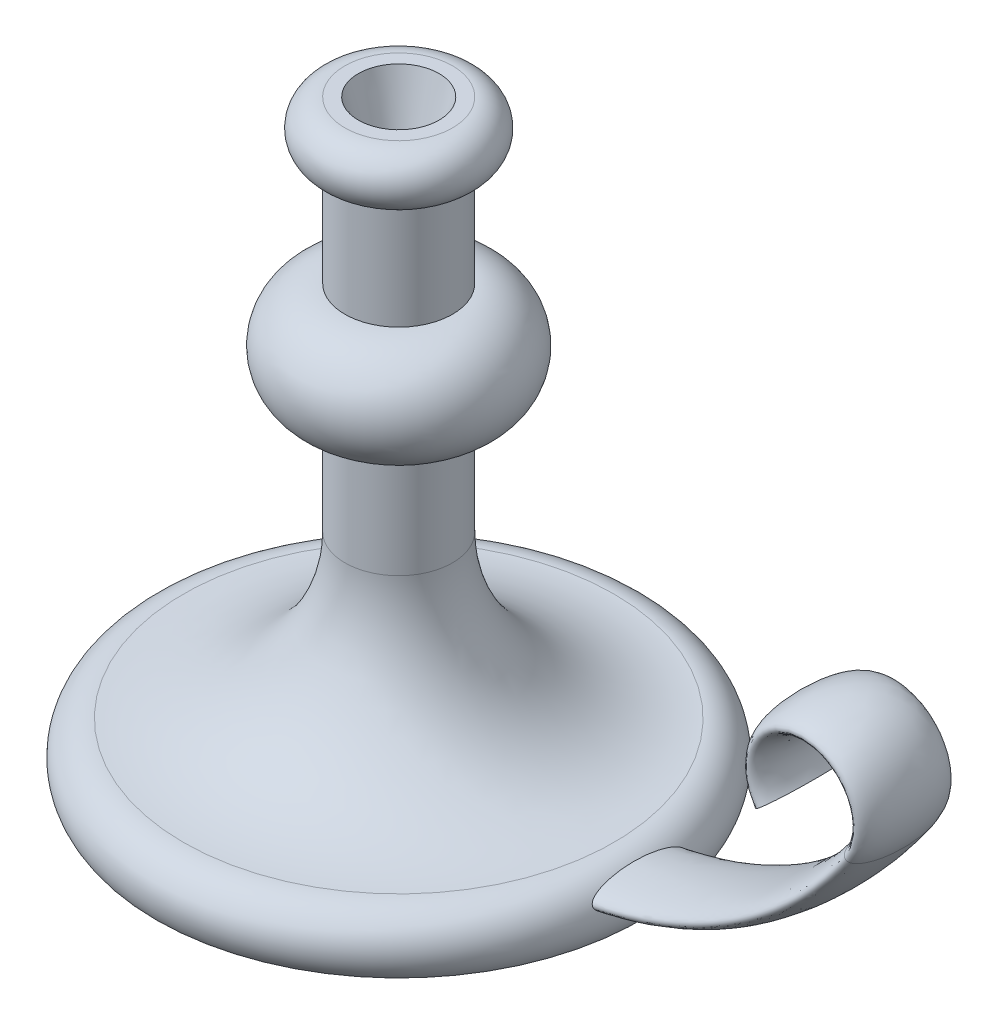
ISO-10303-21;
HEADER;
FILE_DESCRIPTION(('STEP AP214'),'2;1');
FILE_NAME('part.step','',(''),(''),'','','');
FILE_SCHEMA(('AUTOMOTIVE_DESIGN { 1 0 10303 214 1 1 1 1 }'));
ENDSEC;
DATA;
#1=APPLICATION_CONTEXT('core data for automotive mechanical design processes');
#2=APPLICATION_PROTOCOL_DEFINITION('international standard','automotive_design',2000,#1);
#3=PRODUCT_CONTEXT('',#1,'mechanical');
#4=PRODUCT('Part','Part','',(#3));
#5=PRODUCT_RELATED_PRODUCT_CATEGORY('part','',(#4));
#6=PRODUCT_DEFINITION_FORMATION('','',#4);
#7=PRODUCT_DEFINITION_CONTEXT('part definition',#1,'design');
#8=PRODUCT_DEFINITION('design','',#6,#7);
#9=PRODUCT_DEFINITION_SHAPE('','',#8);
#10=(LENGTH_UNIT() NAMED_UNIT(*) SI_UNIT(.MILLI.,.METRE.));
#11=(NAMED_UNIT(*) PLANE_ANGLE_UNIT() SI_UNIT($,.RADIAN.));
#12=(NAMED_UNIT(*) SI_UNIT($,.STERADIAN.) SOLID_ANGLE_UNIT());
#13=UNCERTAINTY_MEASURE_WITH_UNIT(LENGTH_MEASURE(1.E-05),#10,'distance_accuracy_value','');
#14=(GEOMETRIC_REPRESENTATION_CONTEXT(3) GLOBAL_UNCERTAINTY_ASSIGNED_CONTEXT((#13)) GLOBAL_UNIT_ASSIGNED_CONTEXT((#10,
#11,#12)) REPRESENTATION_CONTEXT('',''));
#15=CARTESIAN_POINT('',(0.,0.,0.));
#16=DIRECTION('',(0.,0.,1.));
#17=DIRECTION('',(1.,0.,0.));
#18=AXIS2_PLACEMENT_3D('',#15,#16,#17);
#19=CARTESIAN_POINT('',(0.,0.,0.));
#20=DIRECTION('',(0.,-1.,0.));
#21=DIRECTION('',(0.,0.,-1.));
#22=AXIS2_PLACEMENT_3D('',#19,#20,#21);
#23=PLANE('',#22);
#24=CARTESIAN_POINT('',(0.,0.,0.));
#25=DIRECTION('',(0.,-1.,0.));
#26=DIRECTION('',(0.,0.,-1.));
#27=AXIS2_PLACEMENT_3D('',#24,#25,#26);
#28=CIRCLE('',#27,90.);
#29=CARTESIAN_POINT('',(0.,0.,-90.));
#30=VERTEX_POINT('',#29);
#31=EDGE_CURVE('E79',#30,#30,#28,.T.);
#32=ORIENTED_EDGE('',*,*,#31,.T.);
#33=EDGE_LOOP('',(#32));
#34=FACE_BOUND('',#33,.T.);
#35=ADVANCED_FACE('F39',(#34),#23,.T.);
#36=CARTESIAN_POINT('',(0.,220.,0.));
#37=DIRECTION('',(0.,1.,0.));
#38=DIRECTION('',(0.,0.,1.));
#39=AXIS2_PLACEMENT_3D('',#36,#37,#38);
#40=PLANE('',#39);
#41=CARTESIAN_POINT('',(0.,220.,0.));
#42=DIRECTION('',(0.,1.,0.));
#43=DIRECTION('',(0.,0.,1.));
#44=AXIS2_PLACEMENT_3D('',#41,#42,#43);
#45=CIRCLE('',#44,15.);
#46=CARTESIAN_POINT('',(0.,220.,15.));
#47=VERTEX_POINT('',#46);
#48=EDGE_CURVE('E95',#47,#47,#45,.T.);
#49=ORIENTED_EDGE('',*,*,#48,.F.);
#50=EDGE_LOOP('',(#49));
#51=FACE_BOUND('',#50,.T.);
#52=CARTESIAN_POINT('',(0.,220.,0.));
#53=DIRECTION('',(0.,-1.,0.));
#54=DIRECTION('',(0.,0.,-1.));
#55=AXIS2_PLACEMENT_3D('',#52,#53,#54);
#56=CIRCLE('',#55,20.);
#57=CARTESIAN_POINT('',(0.,220.,-20.));
#58=VERTEX_POINT('',#57);
#59=EDGE_CURVE('E51',#58,#58,#56,.T.);
#60=ORIENTED_EDGE('',*,*,#59,.F.);
#61=EDGE_LOOP('',(#60));
#62=FACE_BOUND('',#61,.T.);
#63=ADVANCED_FACE('F102',(#51,#62),#40,.T.);
#64=CARTESIAN_POINT('',(0.,210.,0.));
#65=DIRECTION('',(0.,-1.,0.));
#66=DIRECTION('',(0.,0.,-1.));
#67=AXIS2_PLACEMENT_3D('',#64,#65,#66);
#68=TOROIDAL_SURFACE('',#67,20.,10.);
#69=ORIENTED_EDGE('',*,*,#59,.T.);
#70=EDGE_LOOP('',(#69));
#71=FACE_BOUND('',#70,.T.);
#72=CARTESIAN_POINT('',(0.,200.,0.));
#73=DIRECTION('',(0.,-1.,0.));
#74=DIRECTION('',(0.,0.,-1.));
#75=AXIS2_PLACEMENT_3D('',#72,#73,#74);
#76=CIRCLE('',#75,20.);
#77=CARTESIAN_POINT('',(0.,200.,-20.));
#78=VERTEX_POINT('',#77);
#79=EDGE_CURVE('E56',#78,#78,#76,.T.);
#80=ORIENTED_EDGE('',*,*,#79,.F.);
#81=EDGE_LOOP('',(#80));
#82=FACE_BOUND('',#81,.T.);
#83=ADVANCED_FACE('F105',(#71,#82),#68,.T.);
#84=CARTESIAN_POINT('',(0.,0.,0.));
#85=DIRECTION('',(0.,-1.,0.));
#86=DIRECTION('',(0.,0.,-1.));
#87=AXIS2_PLACEMENT_3D('',#84,#85,#86);
#88=CYLINDRICAL_SURFACE('',#87,20.);
#89=ORIENTED_EDGE('',*,*,#79,.T.);
#90=EDGE_LOOP('',(#89));
#91=FACE_BOUND('',#90,.T.);
#92=CARTESIAN_POINT('',(0.,160.,0.));
#93=DIRECTION('',(0.,-1.,0.));
#94=DIRECTION('',(0.,0.,-1.));
#95=AXIS2_PLACEMENT_3D('',#92,#93,#94);
#96=CIRCLE('',#95,20.);
#97=CARTESIAN_POINT('',(0.,160.,-20.));
#98=VERTEX_POINT('',#97);
#99=EDGE_CURVE('E61',#98,#98,#96,.T.);
#100=ORIENTED_EDGE('',*,*,#99,.F.);
#101=EDGE_LOOP('',(#100));
#102=FACE_BOUND('',#101,.T.);
#103=ADVANCED_FACE('F110',(#91,#102),#88,.T.);
#104=CARTESIAN_POINT('',(0.,140.,0.));
#105=DIRECTION('',(0.,-1.,0.));
#106=DIRECTION('',(0.,0.,-1.));
#107=AXIS2_PLACEMENT_3D('',#104,#105,#106);
#108=DEGENERATE_TOROIDAL_SURFACE('',#107,20.,20.,.T.);
#109=ORIENTED_EDGE('',*,*,#99,.T.);
#110=EDGE_LOOP('',(#109));
#111=FACE_BOUND('',#110,.T.);
#112=CARTESIAN_POINT('',(0.,120.,0.));
#113=DIRECTION('',(0.,-1.,0.));
#114=DIRECTION('',(0.,0.,-1.));
#115=AXIS2_PLACEMENT_3D('',#112,#113,#114);
#116=CIRCLE('',#115,20.);
#117=CARTESIAN_POINT('',(0.,120.,-20.));
#118=VERTEX_POINT('',#117);
#119=EDGE_CURVE('E67',#118,#118,#116,.T.);
#120=ORIENTED_EDGE('',*,*,#119,.F.);
#121=EDGE_LOOP('',(#120));
#122=FACE_BOUND('',#121,.T.);
#123=ADVANCED_FACE('F116',(#111,#122),#108,.T.);
#124=CARTESIAN_POINT('',(0.,0.,0.));
#125=DIRECTION('',(0.,-1.,0.));
#126=DIRECTION('',(0.,0.,-1.));
#127=AXIS2_PLACEMENT_3D('',#124,#125,#126);
#128=CYLINDRICAL_SURFACE('',#127,20.);
#129=ORIENTED_EDGE('',*,*,#119,.T.);
#130=EDGE_LOOP('',(#129));
#131=FACE_BOUND('',#130,.T.);
#132=CARTESIAN_POINT('',(0.,80.,0.));
#133=DIRECTION('',(0.,-1.,0.));
#134=DIRECTION('',(0.,0.,-1.));
#135=AXIS2_PLACEMENT_3D('',#132,#133,#134);
#136=CIRCLE('',#135,20.);
#137=CARTESIAN_POINT('',(0.,80.,-20.));
#138=VERTEX_POINT('',#137);
#139=EDGE_CURVE('E71',#138,#138,#136,.T.);
#140=ORIENTED_EDGE('',*,*,#139,.F.);
#141=EDGE_LOOP('',(#140));
#142=FACE_BOUND('',#141,.T.);
#143=ADVANCED_FACE('F120',(#131,#142),#128,.T.);
#144=CARTESIAN_POINT('',(0.,80.,0.));
#145=DIRECTION('',(0.,-1.,0.));
#146=DIRECTION('',(0.,0.,-1.));
#147=AXIS2_PLACEMENT_3D('',#144,#145,#146);
#148=TOROIDAL_SURFACE('',#147,80.,60.);
#149=ORIENTED_EDGE('',*,*,#139,.T.);
#150=EDGE_LOOP('',(#149));
#151=FACE_BOUND('',#150,.T.);
#152=CARTESIAN_POINT('',(0.,20.,0.));
#153=DIRECTION('',(0.,-1.,0.));
#154=DIRECTION('',(0.,0.,-1.));
#155=AXIS2_PLACEMENT_3D('',#152,#153,#154);
#156=CIRCLE('',#155,80.);
#157=CARTESIAN_POINT('',(0.,20.,-80.));
#158=VERTEX_POINT('',#157);
#159=EDGE_CURVE('E75',#158,#158,#156,.T.);
#160=ORIENTED_EDGE('',*,*,#159,.F.);
#161=EDGE_LOOP('',(#160));
#162=FACE_BOUND('',#161,.T.);
#163=ADVANCED_FACE('F124',(#151,#162),#148,.F.);
#164=CARTESIAN_POINT('',(0.,7.50000000000001,0.));
#165=DIRECTION('',(0.,-1.,0.));
#166=DIRECTION('',(0.,0.,-1.));
#167=AXIS2_PLACEMENT_3D('',#164,#165,#166);
#168=TOROIDAL_SURFACE('',#167,80.,12.5);
#169=CARTESIAN_POINT('',(89.5597422043342,12.9414346567555,-17.5));
#170=CARTESIAN_POINT('',(89.5390618403562,12.9834100865229,-17.4999996776707));
#171=CARTESIAN_POINT('',(89.5184817634659,13.0254349004937,-17.4978446678338));
#172=CARTESIAN_POINT('',(89.4776811982744,13.1092324497794,-17.4892861575811));
#173=CARTESIAN_POINT('',(89.4574608430711,13.1510050881611,-17.4828811168849));
#174=CARTESIAN_POINT('',(89.397540281121,13.2754779151414,-17.4575154450276));
#175=CARTESIAN_POINT('',(89.3585808220612,13.357332519418,-17.4324042670614));
#176=CARTESIAN_POINT('',(89.2734407804367,13.5379179993389,-17.3597430943198));
#177=CARTESIAN_POINT('',(89.2281116968574,13.6353152430682,-17.3079906529225));
#178=CARTESIAN_POINT('',(89.142156713761,13.821757010941,-17.1881654215547));
#179=CARTESIAN_POINT('',(89.10154096816,13.9107834263932,-17.1200583326704));
#180=CARTESIAN_POINT('',(89.0298799325304,14.0690063055582,-16.9825317839868));
#181=CARTESIAN_POINT('',(88.9982856031081,14.1392491335226,-16.9145677994464));
#182=CARTESIAN_POINT('',(88.9378435588022,14.2742914925202,-16.7722502997375));
#183=CARTESIAN_POINT('',(88.9089980734782,14.3390866000317,-16.6978916893925));
#184=CARTESIAN_POINT('',(88.8536099995594,14.4639626152392,-16.5442177801531));
#185=CARTESIAN_POINT('',(88.8270733532937,14.5240313225779,-16.4648905452803));
#186=CARTESIAN_POINT('',(88.7760376587064,14.6398576639347,-16.3025863942461));
#187=CARTESIAN_POINT('',(88.7515379613228,14.6956166708123,-16.2196106536441));
#188=CARTESIAN_POINT('',(88.7047328205489,14.8023169553036,-16.052427362784));
#189=CARTESIAN_POINT('',(88.6823939519366,14.8533308765833,-15.9682752160745));
#190=CARTESIAN_POINT('',(88.639155365759,14.9521540950118,-15.797741621076));
#191=CARTESIAN_POINT('',(88.6182558899722,14.9999628537458,-15.711359801597));
#192=CARTESIAN_POINT('',(88.5573681790009,15.1392585624723,-15.4492483073626));
#193=CARTESIAN_POINT('',(88.5192579811328,15.2264609786255,-15.2707999543232));
#194=CARTESIAN_POINT('',(88.4468979005837,15.3916731276291,-14.9088289385944));
#195=CARTESIAN_POINT('',(88.4126513155027,15.4696750103546,-14.7253021052891));
#196=CARTESIAN_POINT('',(88.347139159504,15.6182965032923,-14.3538259785736));
#197=CARTESIAN_POINT('',(88.3158872528146,15.6888824046965,-14.1658608782527));
#198=CARTESIAN_POINT('',(88.2560127035516,15.8233792512431,-13.787400391854));
#199=CARTESIAN_POINT('',(88.2273872233003,15.8872974109117,-13.5969079973403));
#200=CARTESIAN_POINT('',(88.1723348827449,16.0094159388249,-13.2138496737791));
#201=CARTESIAN_POINT('',(88.1459074726896,16.06761773743,-13.0212842768931));
#202=CARTESIAN_POINT('',(88.0884248304702,16.1932687928886,-12.5849658119248));
#203=CARTESIAN_POINT('',(88.0579162002184,16.2592725226906,-12.3407253521735));
#204=CARTESIAN_POINT('',(87.9994625659014,16.3844358500305,-11.8501803460782));
#205=CARTESIAN_POINT('',(87.9715178234089,16.4435947494061,-11.6038755919223));
#206=CARTESIAN_POINT('',(87.9178897421858,16.5558889779776,-11.109529987048));
#207=CARTESIAN_POINT('',(87.8922075114269,16.6090213595568,-10.86148834924));
#208=CARTESIAN_POINT('',(87.8429155378603,16.7098546386226,-10.3640943607018));
#209=CARTESIAN_POINT('',(87.8193058942812,16.7575552760878,-10.1147419478211));
#210=CARTESIAN_POINT('',(87.7514718906047,16.8930622945827,-9.36631396644911));
#211=CARTESIAN_POINT('',(87.7101114199141,16.97354616682,-8.86564202060326));
#212=CARTESIAN_POINT('',(87.6344118706354,17.1178657179368,-7.86153551840243));
#213=CARTESIAN_POINT('',(87.600071334108,17.1817048544489,-7.35810155802579));
#214=CARTESIAN_POINT('',(87.5383679228555,17.2943697092708,-6.3522513611189));
#215=CARTESIAN_POINT('',(87.5109639050819,17.3432843238913,-5.84984753787572));
#216=CARTESIAN_POINT('',(87.4628391630611,17.4279603163538,-4.84354228831026));
#217=CARTESIAN_POINT('',(87.4421195253373,17.4637195559667,-4.33964063194106));
#218=CARTESIAN_POINT('',(87.4074386787955,17.5229738360405,-3.33084363886029));
#219=CARTESIAN_POINT('',(87.3934780874882,17.5464677559495,-2.82594821558697));
#220=CARTESIAN_POINT('',(87.3724154174235,17.5817273168609,-1.81615213380819));
#221=CARTESIAN_POINT('',(87.3653059747339,17.5935055508652,-1.31125206554536));
#222=CARTESIAN_POINT('',(87.3579750479625,17.6056484066489,-0.301318309133058));
#223=CARTESIAN_POINT('',(87.3577528582351,17.6060141977103,0.203715360025943));
#224=CARTESIAN_POINT('',(87.3641963426439,17.5953454261039,1.21356726554155));
#225=CARTESIAN_POINT('',(87.3708612610896,17.5843121142068,1.71838551945494));
#226=CARTESIAN_POINT('',(87.3886163883338,17.554616306541,2.60695068649839));
#227=CARTESIAN_POINT('',(87.3982690399213,17.5384060734754,2.99081046478826));
#228=CARTESIAN_POINT('',(87.421496688066,17.4990063104014,3.75807002785699));
#229=CARTESIAN_POINT('',(87.4350718235981,17.4758165331044,4.14146979585415));
#230=CARTESIAN_POINT('',(87.4661109016121,17.4221255760208,4.90767543763198));
#231=CARTESIAN_POINT('',(87.4835755913649,17.3916229911934,5.29048118303748));
#232=CARTESIAN_POINT('',(87.52247652696,17.3226675403927,6.05728766608026));
#233=CARTESIAN_POINT('',(87.5439339089184,17.2841722314846,6.44128353835431));
#234=CARTESIAN_POINT('',(87.5907685418077,17.1987228636429,7.20803081067548));
#235=CARTESIAN_POINT('',(87.6161451191906,17.1517702579396,7.59078241304222));
#236=CARTESIAN_POINT('',(87.6708875244929,17.0486132676473,8.35453102594107));
#237=CARTESIAN_POINT('',(87.7002509792865,16.9924143825779,8.73552894189128));
#238=CARTESIAN_POINT('',(87.7555693385742,16.8844873931685,9.40362807317339));
#239=CARTESIAN_POINT('',(87.7806318626291,16.8349635590469,9.69115955865555));
#240=CARTESIAN_POINT('',(87.8333287645208,16.7293167465828,10.2648242071222));
#241=CARTESIAN_POINT('',(87.8609635304672,16.6731927720484,10.5509571522122));
#242=CARTESIAN_POINT('',(87.9190678138249,16.5534902310351,11.1217112831612));
#243=CARTESIAN_POINT('',(87.9495404231884,16.4899035134826,11.4063304543324));
#244=CARTESIAN_POINT('',(88.0137266324376,16.3541216812727,11.9738772339476));
#245=CARTESIAN_POINT('',(88.0474477220507,16.2819065762202,12.2567992545898));
#246=CARTESIAN_POINT('',(88.1183718381953,16.1280994435204,12.8175821097588));
#247=CARTESIAN_POINT('',(88.1555499028383,16.046573796357,13.0954641920682));
#248=CARTESIAN_POINT('',(88.2343580118385,15.8719007074313,13.6468218234687));
#249=CARTESIAN_POINT('',(88.2759857295859,15.7787593350285,13.9202995902182));
#250=CARTESIAN_POINT('',(88.3426568223939,15.628384040649,14.3254052817092));
#251=CARTESIAN_POINT('',(88.3655500017785,15.5765627213432,14.459402316928));
#252=CARTESIAN_POINT('',(88.4129882653633,15.4688611687535,14.7254525655375));
#253=CARTESIAN_POINT('',(88.4375331689951,15.4129813790936,14.8575059894887));
#254=CARTESIAN_POINT('',(88.4884967907572,15.296726972035,15.1188747284344));
#255=CARTESIAN_POINT('',(88.5149109123159,15.2363633637366,15.248195809858));
#256=CARTESIAN_POINT('',(88.5700241751772,15.1103179001211,15.5037035642082));
#257=CARTESIAN_POINT('',(88.5987227483178,15.0446373670989,15.6298910063173));
#258=CARTESIAN_POINT('',(88.6570151826478,14.9113179601609,15.8704199707059));
#259=CARTESIAN_POINT('',(88.6864417367861,14.8440563407289,15.9850095995261));
#260=CARTESIAN_POINT('',(88.7482816567768,14.7030103830826,16.2094581395952));
#261=CARTESIAN_POINT('',(88.7806974756141,14.6292206899981,16.3193130551169));
#262=CARTESIAN_POINT('',(88.8489097184972,14.4745639616531,16.5315146626624));
#263=CARTESIAN_POINT('',(88.8846785573508,14.3937550191611,16.6339121024916));
#264=CARTESIAN_POINT('',(88.9606113704153,14.2232561160766,16.8291907541922));
#265=CARTESIAN_POINT('',(89.0007675950253,14.1335818404865,16.9220882016583));
#266=CARTESIAN_POINT('',(89.0601235459872,14.0021924630805,17.0411637727685));
#267=CARTESIAN_POINT('',(89.0770574086405,13.9648250339927,17.073294917827));
#268=CARTESIAN_POINT('',(89.1117704043089,13.8885105828123,17.1351129203988));
#269=CARTESIAN_POINT('',(89.1295494801999,13.8495636674962,17.1647999427302));
#270=CARTESIAN_POINT('',(89.1842722230347,13.7301865324198,17.2496672583031));
#271=CARTESIAN_POINT('',(89.2225929343977,13.6472387371287,17.3006362954167));
#272=CARTESIAN_POINT('',(89.2830198855205,13.5177923286577,17.3659392171784));
#273=CARTESIAN_POINT('',(89.3038035106326,13.4734899832391,17.385944655127));
#274=CARTESIAN_POINT('',(89.3462357272131,13.3835498526412,17.421521231844));
#275=CARTESIAN_POINT('',(89.3678838017236,13.3379128698458,17.4370949768747));
#276=CARTESIAN_POINT('',(89.411904802424,13.2456714845448,17.4633118273198));
#277=CARTESIAN_POINT('',(89.4342765183816,13.1990687398024,17.4739627514632));
#278=CARTESIAN_POINT('',(89.4796070415907,13.1052444737537,17.4900003628641));
#279=CARTESIAN_POINT('',(89.5025657624809,13.0580230439622,17.495387819971));
#280=CARTESIAN_POINT('',(89.5464271716018,12.9684112208445,17.5004320668286));
#281=CARTESIAN_POINT('',(89.5672934245652,12.9260327119426,17.5006298436875));
#282=CARTESIAN_POINT('',(89.6091580078856,12.8415284156483,17.496667300483));
#283=CARTESIAN_POINT('',(89.6301563797468,12.7994027167221,17.4925055351934));
#284=CARTESIAN_POINT('',(89.6721156351431,12.7157496198108,17.479965082583));
#285=CARTESIAN_POINT('',(89.6930765014329,12.6742224548788,17.4715847960013));
#286=CARTESIAN_POINT('',(89.7348115258834,12.5920532516238,17.450862522026));
#287=CARTESIAN_POINT('',(89.755585576578,12.5514117057388,17.4385183877269));
#288=CARTESIAN_POINT('',(89.8013847331776,12.4623676182577,17.4070626989759));
#289=CARTESIAN_POINT('',(89.8263321178974,12.4142402057079,17.3870577635768));
#290=CARTESIAN_POINT('',(89.8756026524763,12.3198942829529,17.3423007335127));
#291=CARTESIAN_POINT('',(89.8999253272692,12.2736772101064,17.317545140678));
#292=CARTESIAN_POINT('',(89.9718636752115,12.1379719567039,17.2371059859825));
#293=CARTESIAN_POINT('',(90.0184026508769,12.051520920799,17.1752845379973));
#294=CARTESIAN_POINT('',(90.1015176697339,11.8991704299987,17.0502729237444));
#295=CARTESIAN_POINT('',(90.1385373685485,11.832138329749,16.9886971231214));
#296=CARTESIAN_POINT('',(90.2104869329279,11.7032426034951,16.8591573255862));
#297=CARTESIAN_POINT('',(90.2454151408799,11.6413830620089,16.7911883686367));
#298=CARTESIAN_POINT('',(90.3133841124366,11.5222099067343,16.6502911436157));
#299=CARTESIAN_POINT('',(90.3464212107125,11.4649050425,16.577353807455));
#300=CARTESIAN_POINT('',(90.4107258034174,11.3544143267812,16.427734996584));
#301=CARTESIAN_POINT('',(90.4419937497579,11.3012274221162,16.3510544874358));
#302=CARTESIAN_POINT('',(90.5066142435688,11.1922810586096,16.185318952537));
#303=CARTESIAN_POINT('',(90.5397652495639,11.1369814833086,16.0958847835331));
#304=CARTESIAN_POINT('',(90.6043042941242,11.0303194621557,15.9140859303205));
#305=CARTESIAN_POINT('',(90.6356921559875,10.978957410734,15.8217209538336));
#306=CARTESIAN_POINT('',(90.6968383877971,10.8797698841651,15.6347974994413));
#307=CARTESIAN_POINT('',(90.7265992701637,10.8319389137698,15.540242744142));
#308=CARTESIAN_POINT('',(90.7846969346251,10.7393295137681,15.3492353522605));
#309=CARTESIAN_POINT('',(90.8130337948203,10.6945509167066,15.2527828201663));
#310=CARTESIAN_POINT('',(90.8771212205239,10.5940589597549,15.0277319837683));
#311=CARTESIAN_POINT('',(90.9124022819657,10.5393328792865,14.8985593440141));
#312=CARTESIAN_POINT('',(90.9809741103801,10.4339610325184,14.6380328432609));
#313=CARTESIAN_POINT('',(91.0142645951402,10.3833158444317,14.5066786763347));
#314=CARTESIAN_POINT('',(91.1115171918213,10.2366440116077,14.109681091878));
#315=CARTESIAN_POINT('',(91.1727828792966,10.1460018602114,13.8413800425918));
#316=CARTESIAN_POINT('',(91.289286281246,9.97615455726912,13.2997906638458));
#317=CARTESIAN_POINT('',(91.3445203789088,9.89695625887037,13.0264994554535));
#318=CARTESIAN_POINT('',(91.449980571998,9.74769654866266,12.4748594155947));
#319=CARTESIAN_POINT('',(91.5001780442572,9.67768673078018,12.1964912536697));
#320=CARTESIAN_POINT('',(91.5957501918068,9.54592534416387,11.6372393425743));
#321=CARTESIAN_POINT('',(91.6411285723794,9.4841674211763,11.3563577087905));
#322=CARTESIAN_POINT('',(91.7275132616964,9.36779787162548,10.7925089006675));
#323=CARTESIAN_POINT('',(91.7685202729419,9.31318509647923,10.5095420692681));
#324=CARTESIAN_POINT('',(91.8503345045436,9.20520508711806,9.91387150213587));
#325=CARTESIAN_POINT('',(91.8907217744488,9.15249390095813,9.60099168323567));
#326=CARTESIAN_POINT('',(91.9669218199109,9.05389158705534,8.97359688181902));
#327=CARTESIAN_POINT('',(92.002734366163,9.00800080116139,8.65908181815877));
#328=CARTESIAN_POINT('',(92.07003298894,8.92240020575308,8.0286556880871));
#329=CARTESIAN_POINT('',(92.1015177516249,8.88269227276197,7.71274422766426));
#330=CARTESIAN_POINT('',(92.1603325838503,8.80898713679307,7.07986626810543));
#331=CARTESIAN_POINT('',(92.1876625005419,8.77499014390502,6.76289973059331));
#332=CARTESIAN_POINT('',(92.263503001365,8.68114273902099,5.81249868362167));
#333=CARTESIAN_POINT('',(92.3060517448553,8.62919999492192,5.17778747193791));
#334=CARTESIAN_POINT('',(92.3760091017524,8.5443131845069,3.90627938186771));
#335=CARTESIAN_POINT('',(92.4034169750229,8.51137004695189,3.26948240305234));
#336=CARTESIAN_POINT('',(92.4435085691828,8.4633170228412,1.9954574177839));
#337=CARTESIAN_POINT('',(92.4562084043365,8.44818761908848,1.35823064985365));
#338=CARTESIAN_POINT('',(92.4671302630246,8.43517103988553,0.0834423270809979));
#339=CARTESIAN_POINT('',(92.4653514271759,8.43728488791033,-0.554119245387866));
#340=CARTESIAN_POINT('',(92.4472853754493,8.45883344750922,-1.82886328296967));
#341=CARTESIAN_POINT('',(92.4309954438924,8.47827140120328,-2.46604565478079));
#342=CARTESIAN_POINT('',(92.383659062641,8.53514174464794,-3.73902583866987));
#343=CARTESIAN_POINT('',(92.3526140808133,8.57257234445219,-4.37482378215487));
#344=CARTESIAN_POINT('',(92.2921790866404,8.64621329194995,-5.36625544460961));
#345=CARTESIAN_POINT('',(92.2680118235609,8.67578736963479,-5.72271555901848));
#346=CARTESIAN_POINT('',(92.2147013952355,8.74146404735389,-6.43465819603278));
#347=CARTESIAN_POINT('',(92.1855583836334,8.77756644580536,-6.79014074847958));
#348=CARTESIAN_POINT('',(92.1221127048893,8.85679311513347,-7.49983836059458));
#349=CARTESIAN_POINT('',(92.0878103957549,8.89991689880819,-7.8540535064644));
#350=CARTESIAN_POINT('',(92.013798122625,8.99384143269646,-8.56089767223893));
#351=CARTESIAN_POINT('',(91.9740883343959,9.04464193338977,-8.91352674331317));
#352=CARTESIAN_POINT('',(91.9015818240064,9.13842562293713,-9.51226790233089));
#353=CARTESIAN_POINT('',(91.8702370654071,9.17924629619431,-9.75889575934176));
#354=CARTESIAN_POINT('',(91.8045624920057,9.26550036635908,-10.25094196203));
#355=CARTESIAN_POINT('',(91.770232756707,9.31093364041765,-10.4963603397374));
#356=CARTESIAN_POINT('',(91.6984266463272,9.40685898724877,-10.9855805665734));
#357=CARTESIAN_POINT('',(91.6609523533816,9.45734771681961,-11.2293833718165));
#358=CARTESIAN_POINT('',(91.5826038967892,9.56401317099021,-11.7151775621046));
#359=CARTESIAN_POINT('',(91.5417298772536,9.6201896545131,-11.9571690234573));
#360=CARTESIAN_POINT('',(91.4386423376747,9.76351210996379,-12.5384162018483));
#361=CARTESIAN_POINT('',(91.3745858903289,9.85386844470741,-12.876578655777));
#362=CARTESIAN_POINT('',(91.2720163238267,10.0014015523806,-13.379313604131));
#363=CARTESIAN_POINT('',(91.2367090969993,10.0526332971693,-13.5462966135006));
#364=CARTESIAN_POINT('',(91.1637294936457,10.1596261841618,-13.8782853379554));
#365=CARTESIAN_POINT('',(91.1260572231722,10.2153871233019,-14.0432911413073));
#366=CARTESIAN_POINT('',(91.0448513753997,10.3369382727868,-14.3844416693127));
#367=CARTESIAN_POINT('',(91.0010908407915,10.4031767890598,-14.5603739146114));
#368=CARTESIAN_POINT('',(90.9100440331646,10.5428509324198,-14.908531165983));
#369=CARTESIAN_POINT('',(90.8627565865346,10.6162889577863,-15.0807549132313));
#370=CARTESIAN_POINT('',(90.7642492199854,10.7715651970481,-15.4195496037303));
#371=CARTESIAN_POINT('',(90.7130423069866,10.8533759065568,-15.5861368065584));
#372=CARTESIAN_POINT('',(90.6058220172113,11.0275348916429,-15.9120386126949));
#373=CARTESIAN_POINT('',(90.5498128203453,11.1198740259081,-16.0713593593323));
#374=CARTESIAN_POINT('',(90.4444082893052,11.2969255920341,-16.346591008204));
#375=CARTESIAN_POINT('',(90.3961277047705,11.3791055101425,-16.4645448336189));
#376=CARTESIAN_POINT('',(90.2950977924847,11.5538633486867,-16.6911566146551));
#377=CARTESIAN_POINT('',(90.2423390562531,11.6464633011954,-16.7997939840167));
#378=CARTESIAN_POINT('',(90.1590440243457,11.7953014200273,-16.9524870890686));
#379=CARTESIAN_POINT('',(90.1303607600847,11.8469859215397,-17.0019977189781));
#380=CARTESIAN_POINT('',(90.0716181087375,11.953827456151,-17.0963102611099));
#381=CARTESIAN_POINT('',(90.0415584049394,12.0089852895524,-17.1411110817339));
#382=CARTESIAN_POINT('',(89.9801756575596,12.122724663209,-17.2246441347398));
#383=CARTESIAN_POINT('',(89.9488577537651,12.1812926416249,-17.2633984155372));
#384=CARTESIAN_POINT('',(89.8849549671329,12.3020144005062,-17.3335784406431));
#385=CARTESIAN_POINT('',(89.8523712452273,12.3641649194655,-17.3650107233704));
#386=CARTESIAN_POINT('',(89.7981176909034,12.4687258013536,-17.4092508881815));
#387=CARTESIAN_POINT('',(89.7767436177656,12.5101841078546,-17.4246893204628));
#388=CARTESIAN_POINT('',(89.7336969050675,12.5942336377178,-17.4515182330193));
#389=CARTESIAN_POINT('',(89.7120243813912,12.6368244270179,-17.4629102408532));
#390=CARTESIAN_POINT('',(89.6685521390583,12.7228207531292,-17.4812886417918));
#391=CARTESIAN_POINT('',(89.6467526103346,12.766225219827,-17.488280453409));
#392=CARTESIAN_POINT('',(89.6031794397246,12.8535466229688,-17.4976362320133));
#393=CARTESIAN_POINT('',(89.5814057970823,12.8974635440192,-17.5000003376542));
#394=CARTESIAN_POINT('',(89.5597422043342,12.9414346567555,-17.5));
#395=B_SPLINE_CURVE_WITH_KNOTS('',3,(#169,#170,#171,#172,#173,#174,#175,#176,#177,#178,#179,
#180,#181,#182,#183,#184,#185,#186,#187,#188,#189,#190,#191,#192,#193,#194,#195,#196,#197,#198,
#199,#200,#201,#202,#203,#204,#205,#206,#207,#208,#209,#210,#211,#212,#213,#214,#215,#216,#217,
#218,#219,#220,#221,#222,#223,#224,#225,#226,#227,#228,#229,#230,#231,#232,#233,#234,#235,#236,
#237,#238,#239,#240,#241,#242,#243,#244,#245,#246,#247,#248,#249,#250,#251,#252,#253,#254,#255,
#256,#257,#258,#259,#260,#261,#262,#263,#264,#265,#266,#267,#268,#269,#270,#271,#272,#273,#274,
#275,#276,#277,#278,#279,#280,#281,#282,#283,#284,#285,#286,#287,#288,#289,#290,#291,#292,#293,
#294,#295,#296,#297,#298,#299,#300,#301,#302,#303,#304,#305,#306,#307,#308,#309,#310,#311,#312,
#313,#314,#315,#316,#317,#318,#319,#320,#321,#322,#323,#324,#325,#326,#327,#328,#329,#330,#331,
#332,#333,#334,#335,#336,#337,#338,#339,#340,#341,#342,#343,#344,#345,#346,#347,#348,#349,#350,
#351,#352,#353,#354,#355,#356,#357,#358,#359,#360,#361,#362,#363,#364,#365,#366,#367,#368,#369,
#370,#371,#372,#373,#374,#375,#376,#377,#378,#379,#380,#381,#382,#383,#384,#385,#386,#387,#388,
#389,#390,#391,#392,#393,#394),.UNSPECIFIED.,.T.,.F.,(4,2,2,2,2,2,2,2,2,2,2,2,2,2,2,2,2,2,2,2,2,
2,2,2,2,2,2,2,2,2,2,2,2,2,2,2,2,2,2,2,2,2,2,2,2,2,2,2,2,2,2,2,2,2,2,2,2,2,2,2,2,2,2,2,2,2,2,2,2,
2,2,2,2,2,2,2,2,2,2,2,2,2,2,2,2,2,2,2,2,2,2,2,2,2,2,2,2,2,2,2,2,2,2,2,2,2,2,2,2,2,2,2,4),(0.,
0.140326879649325,0.280704643844326,0.561461806499975,0.917225717585823,1.27374235386085,
1.58146302398147,1.88943119593641,2.19816989275474,2.50680983170024,2.80944292372747,
3.11212672643253,3.7183891577019,4.32516518168242,4.93458970782538,5.5433478409353,
6.15195325906641,6.91631911029036,7.68076285707077,8.44557890144714,9.21043154271117,
10.7363530227226,12.2619572680849,13.7782885580522,15.2948661984781,16.81158236824,
18.3266664767783,19.8415953542034,21.3563580231467,22.5092504482306,23.6621837256807,
24.8153386988897,25.974781379963,27.1340250219353,28.2925816429424,29.1710242088838,
30.0495995331113,30.9291435591541,31.8107663507033,32.6864555684207,33.5616891298975,
33.9980703124477,34.4344038665403,34.8696994156046,35.304887039303,35.7129485465613,
36.1213479397353,36.5266413619584,36.931230132163,37.0874810726011,37.2437214677038,
37.5562829439449,37.7147148343191,37.8730533580126,38.0311395270883,38.1892025705742,
38.3307149014329,38.4722741597123,38.6138871242241,38.7555769191151,38.9286541005773,
39.1018592207181,39.4485901352339,39.7429975955386,40.0376353818191,40.3328261359407,
40.6279411430422,40.9585479808935,41.289187893173,41.6193018978016,41.949397777569,
42.38325515086,42.817173888797,43.6859467918768,44.5552378220702,45.4292182663363,
46.302521787528,47.1756847521812,48.1351081860333,49.0945796914523,50.0543418354862,
51.0141392787935,52.9283366636012,54.8426276125086,56.7548192562814,58.6671243992165,
60.5797874956865,62.4922603557698,63.5676819321849,64.6430703071875,65.7183840946027,
66.7936629380624,67.5494303160603,68.3051775707191,69.0604283053776,69.8156470419353,
70.8826765887351,71.4172057561798,71.9517109715328,72.5305894861726,73.1096614946433,
73.6868888443993,74.2636187787012,74.7180950553375,75.1735510009089,75.4046853668801,
75.6358731855896,75.8661972266865,76.0963147970917,76.2435550398534,76.3907396389802,
76.5377426347989,76.6847412260986),.UNSPECIFIED.);
#396=CARTESIAN_POINT('',(89.5597422043342,12.9414346567555,-17.5));
#397=VERTEX_POINT('',#396);
#398=EDGE_CURVE('E10',#397,#397,#395,.T.);
#399=ORIENTED_EDGE('',*,*,#398,.F.);
#400=EDGE_LOOP('',(#399));
#401=FACE_BOUND('',#400,.T.);
#402=ORIENTED_EDGE('',*,*,#159,.T.);
#403=EDGE_LOOP('',(#402));
#404=FACE_BOUND('',#403,.T.);
#405=ORIENTED_EDGE('',*,*,#31,.F.);
#406=EDGE_LOOP('',(#405));
#407=FACE_BOUND('',#406,.T.);
#408=ADVANCED_FACE('F127',(#401,#404,#407),#168,.T.);
#409=CARTESIAN_POINT('',(150.634185358261,75.,0.));
#410=DIRECTION('',(0.566666666666666,-0.823947139620552,0.));
#411=DIRECTION('',(0.,0.,-1.));
#412=AXIS2_PLACEMENT_3D('',#409,#410,#411);
#413=PLANE('',#412);
#414=CARTESIAN_POINT('',(150.634185358261,75.,0.));
#415=DIRECTION('',(0.566666666666666,-0.823947139620552,0.));
#416=DIRECTION('',(0.,0.,-1.));
#417=AXIS2_PLACEMENT_3D('',#414,#415,#416);
#418=ELLIPSE('',#417,17.5,5.);
#419=CARTESIAN_POINT('',(150.634185358261,75.,-17.5));
#420=VERTEX_POINT('',#419);
#421=EDGE_CURVE('E83',#420,#420,#418,.T.);
#422=ORIENTED_EDGE('',*,*,#421,.T.);
#423=EDGE_LOOP('',(#422));
#424=FACE_BOUND('',#423,.T.);
#425=ADVANCED_FACE('F132',(#424),#413,.T.);
#426=CARTESIAN_POINT('',(60.,10.,-17.5));
#427=CARTESIAN_POINT('',(110.410191303973,10.,-17.5));
#428=CARTESIAN_POINT('',(155.026295870831,33.4646670673665,-17.5));
#429=CARTESIAN_POINT('',(183.592070943083,75.,-17.5));
#430=CARTESIAN_POINT('',(60.,20.,-17.5));
#431=CARTESIAN_POINT('',(107.049511883708,20.,-17.5));
#432=CARTESIAN_POINT('',(148.691209479443,41.900355929542,-17.5));
#433=CARTESIAN_POINT('',(175.352599546877,80.6666666666666,-17.5));
#434=CARTESIAN_POINT('',(60.,20.,17.5));
#435=CARTESIAN_POINT('',(107.049511883708,20.,17.5));
#436=CARTESIAN_POINT('',(148.691209479443,41.900355929542,17.5));
#437=CARTESIAN_POINT('',(175.352599546877,80.6666666666666,17.5));
#438=CARTESIAN_POINT('',(60.,10.,17.5));
#439=CARTESIAN_POINT('',(110.410191303973,10.,17.5));
#440=CARTESIAN_POINT('',(155.026295870831,33.4646670673665,17.5));
#441=CARTESIAN_POINT('',(183.592070943083,75.,17.5));
#442=CARTESIAN_POINT('',(60.,0.,17.5));
#443=CARTESIAN_POINT('',(113.770870724238,0.,17.5));
#444=CARTESIAN_POINT('',(161.36138226222,25.0289782051909,17.5));
#445=CARTESIAN_POINT('',(191.831542339288,69.3333333333333,17.5));
#446=CARTESIAN_POINT('',(60.,0.,-17.5));
#447=CARTESIAN_POINT('',(113.770870724238,0.,-17.5));
#448=CARTESIAN_POINT('',(161.36138226222,25.0289782051909,-17.5));
#449=CARTESIAN_POINT('',(191.831542339288,69.3333333333333,-17.5));
#450=CARTESIAN_POINT('',(60.,10.,-17.5));
#451=CARTESIAN_POINT('',(110.410191303973,10.,-17.5));
#452=CARTESIAN_POINT('',(155.026295870831,33.4646670673665,-17.5));
#453=CARTESIAN_POINT('',(183.592070943083,75.,-17.5));
#454=(BOUNDED_SURFACE() B_SPLINE_SURFACE(3,3,((#426,#427,#428,#429),(#430,#431,#432,#433),(#434,
#435,#436,#437),(#438,#439,#440,#441),(#442,#443,#444,#445),(#446,#447,#448,#449),(#450,#451,
#452,#453)),.UNSPECIFIED.,.T.,.F.,.F.) B_SPLINE_SURFACE_WITH_KNOTS((4,3,4),(4,4),(0.,0.5,1.),
(0.,1.),.UNSPECIFIED.) GEOMETRIC_REPRESENTATION_ITEM() RATIONAL_B_SPLINE_SURFACE(((1.,
0.923374135437856,0.923374135437856,1.),(0.333333333333333,0.307791378479285,0.307791378479285,
0.333333333333333),(0.333333333333333,0.307791378479285,0.307791378479285,0.333333333333333),
(1.,0.923374135437856,0.923374135437856,1.),(0.333333333333333,0.307791378479285,
0.307791378479285,0.333333333333333),(0.333333333333333,0.307791378479285,0.307791378479285,
0.333333333333333),(1.,0.923374135437856,0.923374135437856,1.))) REPRESENTATION_ITEM('') SURFACE());
#455=CARTESIAN_POINT('',(183.592070943083,75.,0.));
#456=DIRECTION('',(0.566666666666667,0.823947139620552,0.));
#457=DIRECTION('',(0.,0.,-1.));
#458=AXIS2_PLACEMENT_3D('',#455,#456,#457);
#459=ELLIPSE('',#458,17.5,5.);
#460=CARTESIAN_POINT('',(183.592070943083,75.,-17.5));
#461=VERTEX_POINT('',#460);
#462=EDGE_CURVE('E87',#461,#461,#459,.T.);
#463=ORIENTED_EDGE('',*,*,#398,.T.);
#464=EDGE_LOOP('',(#463));
#465=FACE_BOUND('',#464,.T.);
#466=ORIENTED_EDGE('',*,*,#462,.F.);
#467=EDGE_LOOP('',(#466));
#468=FACE_BOUND('',#467,.T.);
#469=ADVANCED_FACE('F137',(#465,#468),#454,.T.);
#470=CARTESIAN_POINT('',(183.592070943083,75.,-17.5));
#471=CARTESIAN_POINT('',(193.981461744242,90.10642735238,-17.5));
#472=CARTESIAN_POINT('',(185.447347211541,106.333333333333,-17.5));
#473=CARTESIAN_POINT('',(167.113128150672,106.333333333333,-17.5));
#474=CARTESIAN_POINT('',(148.778909089802,106.333333333333,-17.5));
#475=CARTESIAN_POINT('',(140.244794557101,90.1064273523801,-17.5));
#476=CARTESIAN_POINT('',(150.634185358261,75.,-17.5));
#477=CARTESIAN_POINT('',(175.352599546877,80.6666666666667,-17.5));
#478=CARTESIAN_POINT('',(180.547294947457,88.2198803428567,-17.5));
#479=CARTESIAN_POINT('',(176.280237681107,96.3333333333333,-17.5));
#480=CARTESIAN_POINT('',(167.113128150672,96.3333333333333,-17.5));
#481=CARTESIAN_POINT('',(157.946018620237,96.3333333333334,-17.5));
#482=CARTESIAN_POINT('',(153.678961353886,88.2198803428568,-17.5));
#483=CARTESIAN_POINT('',(158.873656754466,80.6666666666667,-17.5));
#484=CARTESIAN_POINT('',(175.352599546877,80.6666666666667,17.5));
#485=CARTESIAN_POINT('',(180.547294947457,88.2198803428567,17.5));
#486=CARTESIAN_POINT('',(176.280237681107,96.3333333333333,17.5));
#487=CARTESIAN_POINT('',(167.113128150672,96.3333333333333,17.5));
#488=CARTESIAN_POINT('',(157.946018620237,96.3333333333334,17.5));
#489=CARTESIAN_POINT('',(153.678961353886,88.2198803428568,17.5));
#490=CARTESIAN_POINT('',(158.873656754466,80.6666666666667,17.5));
#491=CARTESIAN_POINT('',(183.592070943083,75.,17.5));
#492=CARTESIAN_POINT('',(193.981461744242,90.10642735238,17.5));
#493=CARTESIAN_POINT('',(185.447347211541,106.333333333333,17.5));
#494=CARTESIAN_POINT('',(167.113128150672,106.333333333333,17.5));
#495=CARTESIAN_POINT('',(148.778909089802,106.333333333333,17.5));
#496=CARTESIAN_POINT('',(140.244794557101,90.1064273523801,17.5));
#497=CARTESIAN_POINT('',(150.634185358261,75.,17.5));
#498=CARTESIAN_POINT('',(191.831542339288,69.3333333333333,17.5));
#499=CARTESIAN_POINT('',(207.415628541027,91.9929743619034,17.5));
#500=CARTESIAN_POINT('',(194.614456741976,116.333333333333,17.5));
#501=CARTESIAN_POINT('',(167.113128150672,116.333333333333,17.5));
#502=CARTESIAN_POINT('',(139.611799559367,116.333333333333,17.5));
#503=CARTESIAN_POINT('',(126.810627760316,91.9929743619035,17.5));
#504=CARTESIAN_POINT('',(142.394713962055,69.3333333333333,17.5));
#505=CARTESIAN_POINT('',(191.831542339288,69.3333333333333,-17.5));
#506=CARTESIAN_POINT('',(207.415628541027,91.9929743619034,-17.5));
#507=CARTESIAN_POINT('',(194.614456741976,116.333333333333,-17.5));
#508=CARTESIAN_POINT('',(167.113128150672,116.333333333333,-17.5));
#509=CARTESIAN_POINT('',(139.611799559367,116.333333333333,-17.5));
#510=CARTESIAN_POINT('',(126.810627760316,91.9929743619035,-17.5));
#511=CARTESIAN_POINT('',(142.394713962055,69.3333333333333,-17.5));
#512=CARTESIAN_POINT('',(183.592070943083,75.,-17.5));
#513=CARTESIAN_POINT('',(193.981461744242,90.10642735238,-17.5));
#514=CARTESIAN_POINT('',(185.447347211541,106.333333333333,-17.5));
#515=CARTESIAN_POINT('',(167.113128150672,106.333333333333,-17.5));
#516=CARTESIAN_POINT('',(148.778909089802,106.333333333333,-17.5));
#517=CARTESIAN_POINT('',(140.244794557101,90.1064273523801,-17.5));
#518=CARTESIAN_POINT('',(150.634185358261,75.,-17.5));
#519=(BOUNDED_SURFACE() B_SPLINE_SURFACE(3,3,((#470,#471,#472,#473,#474,#475,#476),(#477,#478,
#479,#480,#481,#482,#483),(#484,#485,#486,#487,#488,#489,#490),(#491,#492,#493,#494,#495,#496,
#497),(#498,#499,#500,#501,#502,#503,#504),(#505,#506,#507,#508,#509,#510,#511),(#512,#513,#514,
#515,#516,#517,#518)),.UNSPECIFIED.,.T.,.F.,.F.) B_SPLINE_SURFACE_WITH_KNOTS((4,3,4),(4,3,4),
(0.,0.5,1.),(0.,0.5,1.),
.UNSPECIFIED.) GEOMETRIC_REPRESENTATION_ITEM() RATIONAL_B_SPLINE_SURFACE(((1.,0.643649778750421,
0.643649778750421,1.,0.643649778750421,0.643649778750421,1.),(0.333333333333333,
0.21454992625014,0.21454992625014,0.333333333333333,0.21454992625014,0.21454992625014,
0.333333333333333),(0.333333333333333,0.21454992625014,0.21454992625014,0.333333333333333,
0.21454992625014,0.21454992625014,0.333333333333333),(1.,0.643649778750421,0.643649778750421,1.,
0.643649778750421,0.643649778750421,1.),(0.333333333333333,0.21454992625014,0.21454992625014,
0.333333333333333,0.21454992625014,0.21454992625014,0.333333333333333),(0.333333333333333,
0.21454992625014,0.21454992625014,0.333333333333333,0.21454992625014,0.21454992625014,
0.333333333333333),(1.,0.643649778750421,0.643649778750421,1.,0.643649778750421,
0.643649778750421,1.))) REPRESENTATION_ITEM('') SURFACE());
#520=ORIENTED_EDGE('',*,*,#421,.F.);
#521=EDGE_LOOP('',(#520));
#522=FACE_BOUND('',#521,.T.);
#523=ORIENTED_EDGE('',*,*,#462,.T.);
#524=EDGE_LOOP('',(#523));
#525=FACE_BOUND('',#524,.T.);
#526=ADVANCED_FACE('F134',(#522,#525),#519,.T.);
#527=CARTESIAN_POINT('',(0.,220.,0.));
#528=DIRECTION('',(0.,1.,0.));
#529=DIRECTION('',(0.,0.,1.));
#530=AXIS2_PLACEMENT_3D('',#527,#528,#529);
#531=CONICAL_SURFACE('',#530,15.,0.261799387799149);
#532=CARTESIAN_POINT('',(0.,195.,0.));
#533=DIRECTION('',(0.,1.,0.));
#534=DIRECTION('',(0.,0.,1.));
#535=AXIS2_PLACEMENT_3D('',#532,#533,#534);
#536=CIRCLE('',#535,8.30127018922193);
#537=CARTESIAN_POINT('',(0.,195.,8.30127018922193));
#538=VERTEX_POINT('',#537);
#539=EDGE_CURVE('E91',#538,#538,#536,.T.);
#540=ORIENTED_EDGE('',*,*,#539,.F.);
#541=EDGE_LOOP('',(#540));
#542=FACE_BOUND('',#541,.T.);
#543=ORIENTED_EDGE('',*,*,#48,.T.);
#544=EDGE_LOOP('',(#543));
#545=FACE_BOUND('',#544,.T.);
#546=ADVANCED_FACE('F100',(#542,#545),#531,.F.);
#547=CARTESIAN_POINT('',(0.,195.,0.));
#548=DIRECTION('',(0.,1.,0.));
#549=DIRECTION('',(0.,0.,1.));
#550=AXIS2_PLACEMENT_3D('',#547,#548,#549);
#551=PLANE('',#550);
#552=ORIENTED_EDGE('',*,*,#539,.T.);
#553=EDGE_LOOP('',(#552));
#554=FACE_BOUND('',#553,.T.);
#555=ADVANCED_FACE('F160',(#554),#551,.T.);
#556=CLOSED_SHELL('',(#35,#63,#83,#103,#123,#143,#163,#408,#425,#469,#526,#546,#555));
#557=MANIFOLD_SOLID_BREP('B2',#556);
#558=ADVANCED_BREP_SHAPE_REPRESENTATION('',(#18,#557),#14);
#559=SHAPE_DEFINITION_REPRESENTATION(#9,#558);
ENDSEC;
END-ISO-10303-21;
